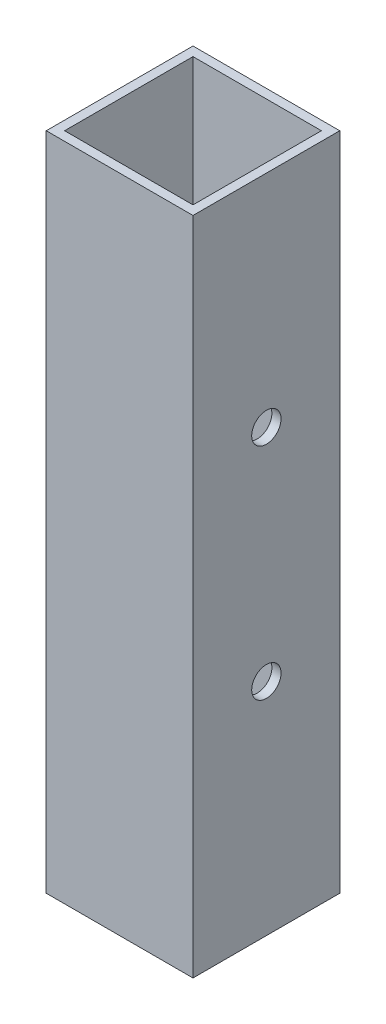
ISO-10303-21;
HEADER;
FILE_DESCRIPTION(('STEP AP214'),'2;1');
FILE_NAME('part.step','',(''),(''),'','','');
FILE_SCHEMA(('AUTOMOTIVE_DESIGN { 1 0 10303 214 1 1 1 1 }'));
ENDSEC;
DATA;
#1=APPLICATION_CONTEXT('core data for automotive mechanical design processes');
#2=APPLICATION_PROTOCOL_DEFINITION('international standard','automotive_design',2000,#1);
#3=PRODUCT_CONTEXT('',#1,'mechanical');
#4=PRODUCT('Part','Part','',(#3));
#5=PRODUCT_RELATED_PRODUCT_CATEGORY('part','',(#4));
#6=PRODUCT_DEFINITION_FORMATION('','',#4);
#7=PRODUCT_DEFINITION_CONTEXT('part definition',#1,'design');
#8=PRODUCT_DEFINITION('design','',#6,#7);
#9=PRODUCT_DEFINITION_SHAPE('','',#8);
#10=(LENGTH_UNIT() NAMED_UNIT(*) SI_UNIT(.MILLI.,.METRE.));
#11=(NAMED_UNIT(*) PLANE_ANGLE_UNIT() SI_UNIT($,.RADIAN.));
#12=(NAMED_UNIT(*) SI_UNIT($,.STERADIAN.) SOLID_ANGLE_UNIT());
#13=UNCERTAINTY_MEASURE_WITH_UNIT(LENGTH_MEASURE(1.E-05),#10,'distance_accuracy_value','');
#14=(GEOMETRIC_REPRESENTATION_CONTEXT(3) GLOBAL_UNCERTAINTY_ASSIGNED_CONTEXT((#13)) GLOBAL_UNIT_ASSIGNED_CONTEXT((#10,
#11,#12)) REPRESENTATION_CONTEXT('',''));
#15=CARTESIAN_POINT('',(0.,0.,0.));
#16=DIRECTION('',(0.,0.,1.));
#17=DIRECTION('',(1.,0.,0.));
#18=AXIS2_PLACEMENT_3D('',#15,#16,#17);
#19=CARTESIAN_POINT('',(11.1125,38.1,0.));
#20=DIRECTION('',(1.,0.,0.));
#21=DIRECTION('',(0.,1.,0.));
#22=AXIS2_PLACEMENT_3D('',#19,#20,#21);
#23=CYLINDRICAL_SURFACE('',#22,2.54);
#24=CARTESIAN_POINT('',(11.1125,38.1,0.));
#25=DIRECTION('',(1.,0.,0.));
#26=DIRECTION('',(0.,1.,0.));
#27=AXIS2_PLACEMENT_3D('',#24,#25,#26);
#28=CIRCLE('',#27,2.54);
#29=CARTESIAN_POINT('',(11.1125,40.64,0.));
#30=VERTEX_POINT('',#29);
#31=EDGE_CURVE('E122',#30,#30,#28,.T.);
#32=ORIENTED_EDGE('',*,*,#31,.F.);
#33=EDGE_LOOP('',(#32));
#34=FACE_BOUND('',#33,.T.);
#35=CARTESIAN_POINT('',(12.7,38.1,0.));
#36=DIRECTION('',(1.,0.,0.));
#37=DIRECTION('',(0.,1.,0.));
#38=AXIS2_PLACEMENT_3D('',#35,#36,#37);
#39=CIRCLE('',#38,2.54);
#40=CARTESIAN_POINT('',(12.7,40.64,0.));
#41=VERTEX_POINT('',#40);
#42=EDGE_CURVE('E20',#41,#41,#39,.T.);
#43=ORIENTED_EDGE('',*,*,#42,.T.);
#44=EDGE_LOOP('',(#43));
#45=FACE_BOUND('',#44,.T.);
#46=ADVANCED_FACE('F16',(#34,#45),#23,.F.);
#47=CARTESIAN_POINT('',(11.1125,76.2,0.));
#48=DIRECTION('',(1.,0.,0.));
#49=DIRECTION('',(0.,1.,0.));
#50=AXIS2_PLACEMENT_3D('',#47,#48,#49);
#51=CYLINDRICAL_SURFACE('',#50,2.54);
#52=CARTESIAN_POINT('',(11.1125,76.2,0.));
#53=DIRECTION('',(1.,0.,0.));
#54=DIRECTION('',(0.,1.,0.));
#55=AXIS2_PLACEMENT_3D('',#52,#53,#54);
#56=CIRCLE('',#55,2.54);
#57=CARTESIAN_POINT('',(11.1125,78.74,0.));
#58=VERTEX_POINT('',#57);
#59=EDGE_CURVE('E95',#58,#58,#56,.T.);
#60=ORIENTED_EDGE('',*,*,#59,.F.);
#61=EDGE_LOOP('',(#60));
#62=FACE_BOUND('',#61,.T.);
#63=CARTESIAN_POINT('',(12.7,76.2,0.));
#64=DIRECTION('',(1.,0.,0.));
#65=DIRECTION('',(0.,1.,0.));
#66=AXIS2_PLACEMENT_3D('',#63,#64,#65);
#67=CIRCLE('',#66,2.54);
#68=CARTESIAN_POINT('',(12.7,78.74,0.));
#69=VERTEX_POINT('',#68);
#70=EDGE_CURVE('E124',#69,#69,#67,.T.);
#71=ORIENTED_EDGE('',*,*,#70,.T.);
#72=EDGE_LOOP('',(#71));
#73=FACE_BOUND('',#72,.T.);
#74=ADVANCED_FACE('F134',(#62,#73),#51,.F.);
#75=CARTESIAN_POINT('',(12.7,0.,-12.7));
#76=DIRECTION('',(-1.,0.,0.));
#77=DIRECTION('',(0.,0.,1.));
#78=AXIS2_PLACEMENT_3D('',#75,#76,#77);
#79=PLANE('',#78);
#80=ORIENTED_EDGE('',*,*,#70,.F.);
#81=EDGE_LOOP('',(#80));
#82=FACE_BOUND('',#81,.T.);
#83=ORIENTED_EDGE('',*,*,#42,.F.);
#84=EDGE_LOOP('',(#83));
#85=FACE_BOUND('',#84,.T.);
#86=DIRECTION('',(0.,1.,0.));
#87=VECTOR('',#86,1.);
#88=CARTESIAN_POINT('',(12.7,57.15,-12.7));
#89=LINE('',#88,#87);
#90=CARTESIAN_POINT('',(12.7,0.,-12.7));
#91=VERTEX_POINT('',#90);
#92=CARTESIAN_POINT('',(12.7,114.3,-12.7));
#93=VERTEX_POINT('',#92);
#94=EDGE_CURVE('E85',#91,#93,#89,.T.);
#95=ORIENTED_EDGE('',*,*,#94,.T.);
#96=DIRECTION('',(0.,0.,1.));
#97=VECTOR('',#96,1.);
#98=CARTESIAN_POINT('',(12.7,114.3,0.));
#99=LINE('',#98,#97);
#100=CARTESIAN_POINT('',(12.7,114.3,12.7));
#101=VERTEX_POINT('',#100);
#102=EDGE_CURVE('E185',#93,#101,#99,.T.);
#103=ORIENTED_EDGE('',*,*,#102,.T.);
#104=DIRECTION('',(0.,-1.,0.));
#105=VECTOR('',#104,1.);
#106=CARTESIAN_POINT('',(12.7,57.15,12.7));
#107=LINE('',#106,#105);
#108=CARTESIAN_POINT('',(12.7,0.,12.7));
#109=VERTEX_POINT('',#108);
#110=EDGE_CURVE('E94',#101,#109,#107,.T.);
#111=ORIENTED_EDGE('',*,*,#110,.T.);
#112=DIRECTION('',(0.,0.,1.));
#113=VECTOR('',#112,1.);
#114=CARTESIAN_POINT('',(12.7,0.,0.));
#115=LINE('',#114,#113);
#116=EDGE_CURVE('E79',#91,#109,#115,.T.);
#117=ORIENTED_EDGE('',*,*,#116,.F.);
#118=EDGE_LOOP('',(#95,#103,#111,#117));
#119=FACE_BOUND('',#118,.T.);
#120=ADVANCED_FACE('F101',(#82,#85,#119),#79,.F.);
#121=CARTESIAN_POINT('',(11.1125,0.,-11.1125));
#122=DIRECTION('',(-1.,0.,0.));
#123=DIRECTION('',(0.,0.,1.));
#124=AXIS2_PLACEMENT_3D('',#121,#122,#123);
#125=PLANE('',#124);
#126=ORIENTED_EDGE('',*,*,#59,.T.);
#127=EDGE_LOOP('',(#126));
#128=FACE_BOUND('',#127,.T.);
#129=ORIENTED_EDGE('',*,*,#31,.T.);
#130=EDGE_LOOP('',(#129));
#131=FACE_BOUND('',#130,.T.);
#132=DIRECTION('',(0.,0.,-1.));
#133=VECTOR('',#132,1.);
#134=CARTESIAN_POINT('',(11.1125,114.3,0.));
#135=LINE('',#134,#133);
#136=CARTESIAN_POINT('',(11.1125,114.3,11.1125));
#137=VERTEX_POINT('',#136);
#138=CARTESIAN_POINT('',(11.1125,114.3,-11.1125));
#139=VERTEX_POINT('',#138);
#140=EDGE_CURVE('E172',#137,#139,#135,.T.);
#141=ORIENTED_EDGE('',*,*,#140,.T.);
#142=DIRECTION('',(0.,1.,0.));
#143=VECTOR('',#142,1.);
#144=CARTESIAN_POINT('',(11.1125,57.15,-11.1125));
#145=LINE('',#144,#143);
#146=CARTESIAN_POINT('',(11.1125,0.,-11.1125));
#147=VERTEX_POINT('',#146);
#148=EDGE_CURVE('E173',#147,#139,#145,.T.);
#149=ORIENTED_EDGE('',*,*,#148,.F.);
#150=DIRECTION('',(0.,0.,-1.));
#151=VECTOR('',#150,1.);
#152=CARTESIAN_POINT('',(11.1125,0.,0.));
#153=LINE('',#152,#151);
#154=CARTESIAN_POINT('',(11.1125,0.,11.1125));
#155=VERTEX_POINT('',#154);
#156=EDGE_CURVE('E105',#155,#147,#153,.T.);
#157=ORIENTED_EDGE('',*,*,#156,.F.);
#158=DIRECTION('',(0.,-1.,0.));
#159=VECTOR('',#158,1.);
#160=CARTESIAN_POINT('',(11.1125,57.15,11.1125));
#161=LINE('',#160,#159);
#162=EDGE_CURVE('E175',#137,#155,#161,.T.);
#163=ORIENTED_EDGE('',*,*,#162,.F.);
#164=EDGE_LOOP('',(#141,#149,#157,#163));
#165=FACE_BOUND('',#164,.T.);
#166=ADVANCED_FACE('F133',(#128,#131,#165),#125,.T.);
#167=CARTESIAN_POINT('',(-12.7,0.,-12.7));
#168=DIRECTION('',(0.,0.,1.));
#169=DIRECTION('',(1.,0.,0.));
#170=AXIS2_PLACEMENT_3D('',#167,#168,#169);
#171=PLANE('',#170);
#172=DIRECTION('',(0.,1.,0.));
#173=VECTOR('',#172,1.);
#174=CARTESIAN_POINT('',(-12.7,57.15,-12.7));
#175=LINE('',#174,#173);
#176=CARTESIAN_POINT('',(-12.7,0.,-12.7));
#177=VERTEX_POINT('',#176);
#178=CARTESIAN_POINT('',(-12.7,114.3,-12.7));
#179=VERTEX_POINT('',#178);
#180=EDGE_CURVE('E214',#177,#179,#175,.T.);
#181=ORIENTED_EDGE('',*,*,#180,.T.);
#182=DIRECTION('',(1.,0.,0.));
#183=VECTOR('',#182,1.);
#184=CARTESIAN_POINT('',(0.,114.3,-12.7));
#185=LINE('',#184,#183);
#186=EDGE_CURVE('E90',#179,#93,#185,.T.);
#187=ORIENTED_EDGE('',*,*,#186,.T.);
#188=ORIENTED_EDGE('',*,*,#94,.F.);
#189=DIRECTION('',(1.,0.,0.));
#190=VECTOR('',#189,1.);
#191=CARTESIAN_POINT('',(0.,0.,-12.7));
#192=LINE('',#191,#190);
#193=EDGE_CURVE('E88',#177,#91,#192,.T.);
#194=ORIENTED_EDGE('',*,*,#193,.F.);
#195=EDGE_LOOP('',(#181,#187,#188,#194));
#196=FACE_BOUND('',#195,.T.);
#197=ADVANCED_FACE('F87',(#196),#171,.F.);
#198=CARTESIAN_POINT('',(12.7,0.,12.7));
#199=DIRECTION('',(0.,0.,-1.));
#200=DIRECTION('',(-1.,0.,0.));
#201=AXIS2_PLACEMENT_3D('',#198,#199,#200);
#202=PLANE('',#201);
#203=ORIENTED_EDGE('',*,*,#110,.F.);
#204=DIRECTION('',(-1.,0.,0.));
#205=VECTOR('',#204,1.);
#206=CARTESIAN_POINT('',(0.,114.3,12.7));
#207=LINE('',#206,#205);
#208=CARTESIAN_POINT('',(-12.7,114.3,12.7));
#209=VERTEX_POINT('',#208);
#210=EDGE_CURVE('E180',#101,#209,#207,.T.);
#211=ORIENTED_EDGE('',*,*,#210,.T.);
#212=DIRECTION('',(0.,-1.,0.));
#213=VECTOR('',#212,1.);
#214=CARTESIAN_POINT('',(-12.7,57.15,12.7));
#215=LINE('',#214,#213);
#216=CARTESIAN_POINT('',(-12.7,0.,12.7));
#217=VERTEX_POINT('',#216);
#218=EDGE_CURVE('E208',#209,#217,#215,.T.);
#219=ORIENTED_EDGE('',*,*,#218,.T.);
#220=DIRECTION('',(-1.,0.,0.));
#221=VECTOR('',#220,1.);
#222=CARTESIAN_POINT('',(0.,0.,12.7));
#223=LINE('',#222,#221);
#224=EDGE_CURVE('E103',#109,#217,#223,.T.);
#225=ORIENTED_EDGE('',*,*,#224,.F.);
#226=EDGE_LOOP('',(#203,#211,#219,#225));
#227=FACE_BOUND('',#226,.T.);
#228=ADVANCED_FACE('F228',(#227),#202,.F.);
#229=CARTESIAN_POINT('',(-12.7,0.,12.7));
#230=DIRECTION('',(0.,-1.,0.));
#231=DIRECTION('',(0.,0.,-1.));
#232=AXIS2_PLACEMENT_3D('',#229,#230,#231);
#233=PLANE('',#232);
#234=DIRECTION('',(-1.,0.,0.));
#235=VECTOR('',#234,1.);
#236=CARTESIAN_POINT('',(0.,0.,11.1125));
#237=LINE('',#236,#235);
#238=CARTESIAN_POINT('',(-11.1125,0.,11.1125));
#239=VERTEX_POINT('',#238);
#240=EDGE_CURVE('E183',#155,#239,#237,.T.);
#241=ORIENTED_EDGE('',*,*,#240,.F.);
#242=ORIENTED_EDGE('',*,*,#156,.T.);
#243=DIRECTION('',(1.,0.,0.));
#244=VECTOR('',#243,1.);
#245=CARTESIAN_POINT('',(0.,0.,-11.1125));
#246=LINE('',#245,#244);
#247=CARTESIAN_POINT('',(-11.1125,0.,-11.1125));
#248=VERTEX_POINT('',#247);
#249=EDGE_CURVE('E192',#248,#147,#246,.T.);
#250=ORIENTED_EDGE('',*,*,#249,.F.);
#251=DIRECTION('',(0.,0.,-1.));
#252=VECTOR('',#251,1.);
#253=CARTESIAN_POINT('',(-11.1125,0.,0.));
#254=LINE('',#253,#252);
#255=EDGE_CURVE('E119',#239,#248,#254,.T.);
#256=ORIENTED_EDGE('',*,*,#255,.F.);
#257=EDGE_LOOP('',(#241,#242,#250,#256));
#258=FACE_BOUND('',#257,.T.);
#259=ORIENTED_EDGE('',*,*,#116,.T.);
#260=ORIENTED_EDGE('',*,*,#224,.T.);
#261=DIRECTION('',(0.,0.,-1.));
#262=VECTOR('',#261,1.);
#263=CARTESIAN_POINT('',(-12.7,0.,0.));
#264=LINE('',#263,#262);
#265=EDGE_CURVE('E99',#217,#177,#264,.T.);
#266=ORIENTED_EDGE('',*,*,#265,.T.);
#267=ORIENTED_EDGE('',*,*,#193,.T.);
#268=EDGE_LOOP('',(#259,#260,#266,#267));
#269=FACE_BOUND('',#268,.T.);
#270=ADVANCED_FACE('F97',(#258,#269),#233,.T.);
#271=CARTESIAN_POINT('',(-11.1125,0.,-11.1125));
#272=DIRECTION('',(0.,0.,1.));
#273=DIRECTION('',(1.,0.,0.));
#274=AXIS2_PLACEMENT_3D('',#271,#272,#273);
#275=PLANE('',#274);
#276=DIRECTION('',(-1.,0.,0.));
#277=VECTOR('',#276,1.);
#278=CARTESIAN_POINT('',(0.,114.3,-11.1125));
#279=LINE('',#278,#277);
#280=CARTESIAN_POINT('',(-11.1125,114.3,-11.1125));
#281=VERTEX_POINT('',#280);
#282=EDGE_CURVE('E179',#139,#281,#279,.T.);
#283=ORIENTED_EDGE('',*,*,#282,.T.);
#284=DIRECTION('',(0.,1.,0.));
#285=VECTOR('',#284,1.);
#286=CARTESIAN_POINT('',(-11.1125,57.15,-11.1125));
#287=LINE('',#286,#285);
#288=EDGE_CURVE('E201',#248,#281,#287,.T.);
#289=ORIENTED_EDGE('',*,*,#288,.F.);
#290=ORIENTED_EDGE('',*,*,#249,.T.);
#291=ORIENTED_EDGE('',*,*,#148,.T.);
#292=EDGE_LOOP('',(#283,#289,#290,#291));
#293=FACE_BOUND('',#292,.T.);
#294=ADVANCED_FACE('F200',(#293),#275,.T.);
#295=CARTESIAN_POINT('',(-12.7,114.3,12.7));
#296=DIRECTION('',(0.,-1.,0.));
#297=DIRECTION('',(0.,0.,-1.));
#298=AXIS2_PLACEMENT_3D('',#295,#296,#297);
#299=PLANE('',#298);
#300=ORIENTED_EDGE('',*,*,#282,.F.);
#301=ORIENTED_EDGE('',*,*,#140,.F.);
#302=DIRECTION('',(1.,0.,0.));
#303=VECTOR('',#302,1.);
#304=CARTESIAN_POINT('',(0.,114.3,11.1125));
#305=LINE('',#304,#303);
#306=CARTESIAN_POINT('',(-11.1125,114.3,11.1125));
#307=VERTEX_POINT('',#306);
#308=EDGE_CURVE('E217',#307,#137,#305,.T.);
#309=ORIENTED_EDGE('',*,*,#308,.F.);
#310=DIRECTION('',(0.,0.,1.));
#311=VECTOR('',#310,1.);
#312=CARTESIAN_POINT('',(-11.1125,114.3,0.));
#313=LINE('',#312,#311);
#314=EDGE_CURVE('E35',#281,#307,#313,.T.);
#315=ORIENTED_EDGE('',*,*,#314,.F.);
#316=EDGE_LOOP('',(#300,#301,#309,#315));
#317=FACE_BOUND('',#316,.T.);
#318=ORIENTED_EDGE('',*,*,#210,.F.);
#319=ORIENTED_EDGE('',*,*,#102,.F.);
#320=ORIENTED_EDGE('',*,*,#186,.F.);
#321=DIRECTION('',(0.,0.,1.));
#322=VECTOR('',#321,1.);
#323=CARTESIAN_POINT('',(-12.7,114.3,0.));
#324=LINE('',#323,#322);
#325=EDGE_CURVE('E211',#179,#209,#324,.T.);
#326=ORIENTED_EDGE('',*,*,#325,.T.);
#327=EDGE_LOOP('',(#318,#319,#320,#326));
#328=FACE_BOUND('',#327,.T.);
#329=ADVANCED_FACE('F220',(#317,#328),#299,.F.);
#330=CARTESIAN_POINT('',(11.1125,0.,11.1125));
#331=DIRECTION('',(0.,0.,-1.));
#332=DIRECTION('',(-1.,0.,0.));
#333=AXIS2_PLACEMENT_3D('',#330,#331,#332);
#334=PLANE('',#333);
#335=ORIENTED_EDGE('',*,*,#308,.T.);
#336=ORIENTED_EDGE('',*,*,#162,.T.);
#337=ORIENTED_EDGE('',*,*,#240,.T.);
#338=DIRECTION('',(0.,-1.,0.));
#339=VECTOR('',#338,1.);
#340=CARTESIAN_POINT('',(-11.1125,57.15,11.1125));
#341=LINE('',#340,#339);
#342=EDGE_CURVE('E115',#307,#239,#341,.T.);
#343=ORIENTED_EDGE('',*,*,#342,.F.);
#344=EDGE_LOOP('',(#335,#336,#337,#343));
#345=FACE_BOUND('',#344,.T.);
#346=ADVANCED_FACE('F160',(#345),#334,.T.);
#347=CARTESIAN_POINT('',(-12.7,76.2,0.));
#348=DIRECTION('',(1.,0.,0.));
#349=DIRECTION('',(0.,0.,-1.));
#350=AXIS2_PLACEMENT_3D('',#347,#348,#349);
#351=CYLINDRICAL_SURFACE('',#350,2.54);
#352=CARTESIAN_POINT('',(-11.1125,76.2,0.));
#353=DIRECTION('',(1.,0.,0.));
#354=DIRECTION('',(0.,0.,-1.));
#355=AXIS2_PLACEMENT_3D('',#352,#353,#354);
#356=CIRCLE('',#355,2.54);
#357=CARTESIAN_POINT('',(-11.1125,76.2,-2.54));
#358=VERTEX_POINT('',#357);
#359=EDGE_CURVE('E112',#358,#358,#356,.F.);
#360=ORIENTED_EDGE('',*,*,#359,.F.);
#361=EDGE_LOOP('',(#360));
#362=FACE_BOUND('',#361,.T.);
#363=CARTESIAN_POINT('',(-12.7,76.2,0.));
#364=DIRECTION('',(1.,0.,0.));
#365=DIRECTION('',(0.,0.,-1.));
#366=AXIS2_PLACEMENT_3D('',#363,#364,#365);
#367=CIRCLE('',#366,2.54);
#368=CARTESIAN_POINT('',(-12.7,76.2,-2.54));
#369=VERTEX_POINT('',#368);
#370=EDGE_CURVE('E116',#369,#369,#367,.F.);
#371=ORIENTED_EDGE('',*,*,#370,.T.);
#372=EDGE_LOOP('',(#371));
#373=FACE_BOUND('',#372,.T.);
#374=ADVANCED_FACE('F158',(#362,#373),#351,.F.);
#375=CARTESIAN_POINT('',(-12.7,0.,12.7));
#376=DIRECTION('',(1.,0.,0.));
#377=DIRECTION('',(0.,0.,-1.));
#378=AXIS2_PLACEMENT_3D('',#375,#376,#377);
#379=PLANE('',#378);
#380=ORIENTED_EDGE('',*,*,#370,.F.);
#381=EDGE_LOOP('',(#380));
#382=FACE_BOUND('',#381,.T.);
#383=CARTESIAN_POINT('',(-12.7,38.1,0.));
#384=DIRECTION('',(1.,0.,0.));
#385=DIRECTION('',(0.,0.,-1.));
#386=AXIS2_PLACEMENT_3D('',#383,#384,#385);
#387=CIRCLE('',#386,2.54);
#388=CARTESIAN_POINT('',(-12.7,38.1,-2.54));
#389=VERTEX_POINT('',#388);
#390=EDGE_CURVE('E26',#389,#389,#387,.F.);
#391=ORIENTED_EDGE('',*,*,#390,.F.);
#392=EDGE_LOOP('',(#391));
#393=FACE_BOUND('',#392,.T.);
#394=ORIENTED_EDGE('',*,*,#218,.F.);
#395=ORIENTED_EDGE('',*,*,#325,.F.);
#396=ORIENTED_EDGE('',*,*,#180,.F.);
#397=ORIENTED_EDGE('',*,*,#265,.F.);
#398=EDGE_LOOP('',(#394,#395,#396,#397));
#399=FACE_BOUND('',#398,.T.);
#400=ADVANCED_FACE('F154',(#382,#393,#399),#379,.F.);
#401=CARTESIAN_POINT('',(-11.1125,0.,11.1125));
#402=DIRECTION('',(1.,0.,0.));
#403=DIRECTION('',(0.,0.,-1.));
#404=AXIS2_PLACEMENT_3D('',#401,#402,#403);
#405=PLANE('',#404);
#406=ORIENTED_EDGE('',*,*,#359,.T.);
#407=EDGE_LOOP('',(#406));
#408=FACE_BOUND('',#407,.T.);
#409=CARTESIAN_POINT('',(-11.1125,38.1,0.));
#410=DIRECTION('',(1.,0.,0.));
#411=DIRECTION('',(0.,0.,-1.));
#412=AXIS2_PLACEMENT_3D('',#409,#410,#411);
#413=CIRCLE('',#412,2.54);
#414=CARTESIAN_POINT('',(-11.1125,38.1,-2.54));
#415=VERTEX_POINT('',#414);
#416=EDGE_CURVE('E11',#415,#415,#413,.T.);
#417=ORIENTED_EDGE('',*,*,#416,.F.);
#418=EDGE_LOOP('',(#417));
#419=FACE_BOUND('',#418,.T.);
#420=ORIENTED_EDGE('',*,*,#314,.T.);
#421=ORIENTED_EDGE('',*,*,#342,.T.);
#422=ORIENTED_EDGE('',*,*,#255,.T.);
#423=ORIENTED_EDGE('',*,*,#288,.T.);
#424=EDGE_LOOP('',(#420,#421,#422,#423));
#425=FACE_BOUND('',#424,.T.);
#426=ADVANCED_FACE('F18',(#408,#419,#425),#405,.T.);
#427=CARTESIAN_POINT('',(-12.7,38.1,0.));
#428=DIRECTION('',(1.,0.,0.));
#429=DIRECTION('',(0.,0.,-1.));
#430=AXIS2_PLACEMENT_3D('',#427,#428,#429);
#431=CYLINDRICAL_SURFACE('',#430,2.54);
#432=ORIENTED_EDGE('',*,*,#390,.T.);
#433=EDGE_LOOP('',(#432));
#434=FACE_BOUND('',#433,.T.);
#435=ORIENTED_EDGE('',*,*,#416,.T.);
#436=EDGE_LOOP('',(#435));
#437=FACE_BOUND('',#436,.T.);
#438=ADVANCED_FACE('F147',(#434,#437),#431,.F.);
#439=CLOSED_SHELL('',(#46,#74,#120,#166,#197,#228,#270,#294,#329,#346,#374,#400,#426,#438));
#440=MANIFOLD_SOLID_BREP('B1',#439);
#441=ADVANCED_BREP_SHAPE_REPRESENTATION('',(#18,#440),#14);
#442=SHAPE_DEFINITION_REPRESENTATION(#9,#441);
ENDSEC;
END-ISO-10303-21;
